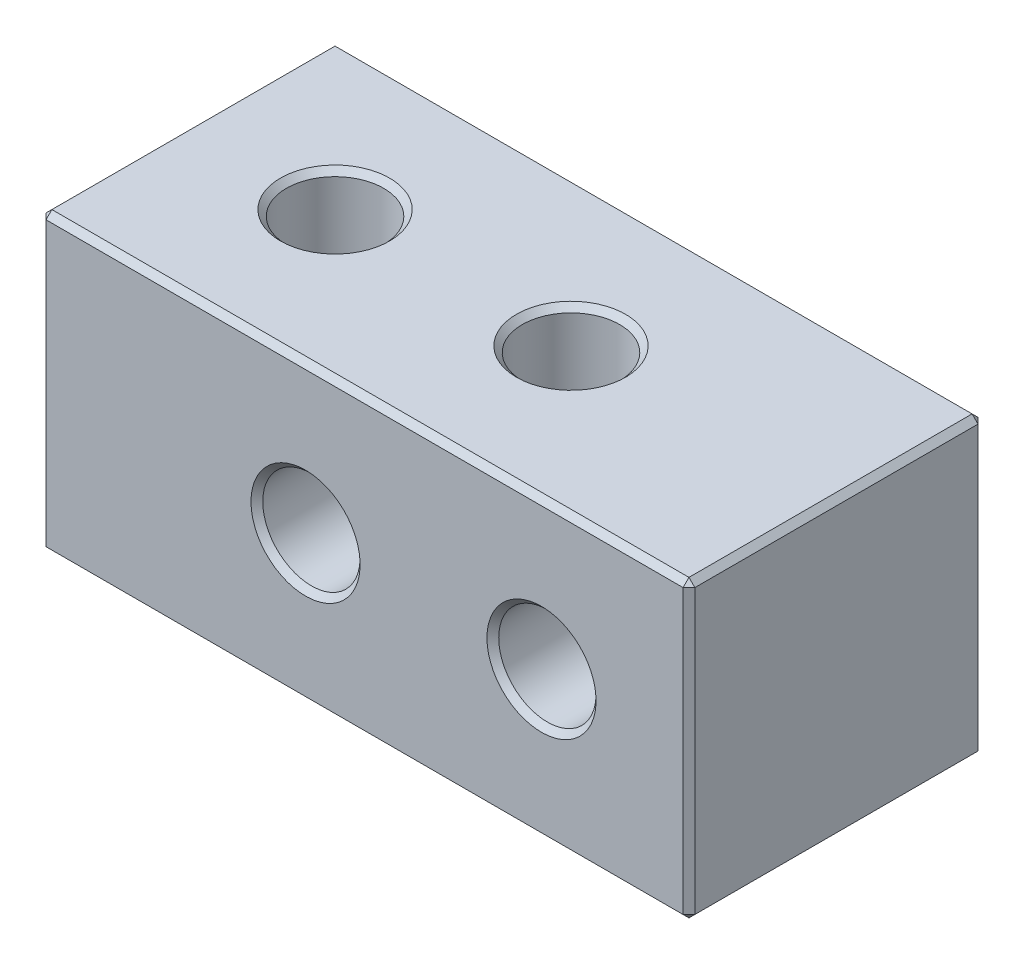
ISO-10303-21;
HEADER;
FILE_DESCRIPTION(('STEP AP214'),'2;1');
FILE_NAME('part.step','',(''),(''),'','','');
FILE_SCHEMA(('AUTOMOTIVE_DESIGN { 1 0 10303 214 1 1 1 1 }'));
ENDSEC;
DATA;
#1=APPLICATION_CONTEXT('core data for automotive mechanical design processes');
#2=APPLICATION_PROTOCOL_DEFINITION('international standard','automotive_design',2000,#1);
#3=PRODUCT_CONTEXT('',#1,'mechanical');
#4=PRODUCT('Part','Part','',(#3));
#5=PRODUCT_RELATED_PRODUCT_CATEGORY('part','',(#4));
#6=PRODUCT_DEFINITION_FORMATION('','',#4);
#7=PRODUCT_DEFINITION_CONTEXT('part definition',#1,'design');
#8=PRODUCT_DEFINITION('design','',#6,#7);
#9=PRODUCT_DEFINITION_SHAPE('','',#8);
#10=(LENGTH_UNIT() NAMED_UNIT(*) SI_UNIT(.MILLI.,.METRE.));
#11=(NAMED_UNIT(*) PLANE_ANGLE_UNIT() SI_UNIT($,.RADIAN.));
#12=(NAMED_UNIT(*) SI_UNIT($,.STERADIAN.) SOLID_ANGLE_UNIT());
#13=UNCERTAINTY_MEASURE_WITH_UNIT(LENGTH_MEASURE(1.E-05),#10,'distance_accuracy_value','');
#14=(GEOMETRIC_REPRESENTATION_CONTEXT(3) GLOBAL_UNCERTAINTY_ASSIGNED_CONTEXT((#13)) GLOBAL_UNIT_ASSIGNED_CONTEXT((#10,
#11,#12)) REPRESENTATION_CONTEXT('',''));
#15=CARTESIAN_POINT('',(0.,0.,0.));
#16=DIRECTION('',(0.,0.,1.));
#17=DIRECTION('',(1.,0.,0.));
#18=AXIS2_PLACEMENT_3D('',#15,#16,#17);
#19=CARTESIAN_POINT('',(11.,5.,-5.));
#20=DIRECTION('',(-1.,0.,0.));
#21=DIRECTION('',(0.,0.,1.));
#22=AXIS2_PLACEMENT_3D('',#19,#20,#21);
#23=PLANE('',#22);
#24=DIRECTION('',(0.,-1.,0.));
#25=VECTOR('',#24,1.);
#26=CARTESIAN_POINT('',(11.,5.,4.8));
#27=LINE('',#26,#25);
#28=CARTESIAN_POINT('',(11.,4.8,4.8));
#29=VERTEX_POINT('',#28);
#30=CARTESIAN_POINT('',(11.,-4.8,4.8));
#31=VERTEX_POINT('',#30);
#32=EDGE_CURVE('E241',#29,#31,#27,.T.);
#33=ORIENTED_EDGE('',*,*,#32,.T.);
#34=DIRECTION('',(0.,0.,-1.));
#35=VECTOR('',#34,1.);
#36=CARTESIAN_POINT('',(11.,-4.8,-5.));
#37=LINE('',#36,#35);
#38=CARTESIAN_POINT('',(11.,-4.8,-4.8));
#39=VERTEX_POINT('',#38);
#40=EDGE_CURVE('E243',#31,#39,#37,.T.);
#41=ORIENTED_EDGE('',*,*,#40,.T.);
#42=DIRECTION('',(0.,1.,0.));
#43=VECTOR('',#42,1.);
#44=CARTESIAN_POINT('',(11.,5.,-4.8));
#45=LINE('',#44,#43);
#46=CARTESIAN_POINT('',(11.,4.8,-4.8));
#47=VERTEX_POINT('',#46);
#48=EDGE_CURVE('E237',#39,#47,#45,.T.);
#49=ORIENTED_EDGE('',*,*,#48,.T.);
#50=DIRECTION('',(0.,0.,1.));
#51=VECTOR('',#50,1.);
#52=CARTESIAN_POINT('',(11.,4.8,5.));
#53=LINE('',#52,#51);
#54=EDGE_CURVE('E239',#47,#29,#53,.T.);
#55=ORIENTED_EDGE('',*,*,#54,.T.);
#56=EDGE_LOOP('',(#33,#41,#49,#55));
#57=FACE_BOUND('',#56,.T.);
#58=ADVANCED_FACE('F41',(#57),#23,.F.);
#59=CARTESIAN_POINT('',(-11.,5.,-5.));
#60=DIRECTION('',(0.,0.,1.));
#61=DIRECTION('',(1.,0.,0.));
#62=AXIS2_PLACEMENT_3D('',#59,#60,#61);
#63=PLANE('',#62);
#64=DIRECTION('',(1.,0.,0.));
#65=VECTOR('',#64,1.);
#66=CARTESIAN_POINT('',(11.,4.8,-5.));
#67=LINE('',#66,#65);
#68=CARTESIAN_POINT('',(-10.8,4.8,-5.));
#69=VERTEX_POINT('',#68);
#70=CARTESIAN_POINT('',(10.8,4.8,-5.));
#71=VERTEX_POINT('',#70);
#72=EDGE_CURVE('E51',#69,#71,#67,.T.);
#73=ORIENTED_EDGE('',*,*,#72,.T.);
#74=DIRECTION('',(0.,-1.,0.));
#75=VECTOR('',#74,1.);
#76=CARTESIAN_POINT('',(10.8,5.,-5.));
#77=LINE('',#76,#75);
#78=CARTESIAN_POINT('',(10.8,-4.8,-5.));
#79=VERTEX_POINT('',#78);
#80=EDGE_CURVE('E11',#71,#79,#77,.T.);
#81=ORIENTED_EDGE('',*,*,#80,.T.);
#82=DIRECTION('',(-1.,0.,0.));
#83=VECTOR('',#82,1.);
#84=CARTESIAN_POINT('',(-11.,-4.8,-5.));
#85=LINE('',#84,#83);
#86=CARTESIAN_POINT('',(-10.8,-4.8,-5.));
#87=VERTEX_POINT('',#86);
#88=EDGE_CURVE('E252',#79,#87,#85,.T.);
#89=ORIENTED_EDGE('',*,*,#88,.T.);
#90=DIRECTION('',(0.,1.,0.));
#91=VECTOR('',#90,1.);
#92=CARTESIAN_POINT('',(-10.8,5.,-5.));
#93=LINE('',#92,#91);
#94=EDGE_CURVE('E62',#87,#69,#93,.T.);
#95=ORIENTED_EDGE('',*,*,#94,.T.);
#96=EDGE_LOOP('',(#73,#81,#89,#95));
#97=FACE_BOUND('',#96,.T.);
#98=CARTESIAN_POINT('',(-2.,0.,-5.));
#99=DIRECTION('',(0.,0.,1.));
#100=DIRECTION('',(1.,0.,0.));
#101=AXIS2_PLACEMENT_3D('',#98,#99,#100);
#102=CIRCLE('',#101,1.85);
#103=CARTESIAN_POINT('',(-0.150000000000001,0.,-5.));
#104=VERTEX_POINT('',#103);
#105=EDGE_CURVE('E249',#104,#104,#102,.T.);
#106=ORIENTED_EDGE('',*,*,#105,.T.);
#107=EDGE_LOOP('',(#106));
#108=FACE_BOUND('',#107,.T.);
#109=CARTESIAN_POINT('',(6.,0.,-5.));
#110=DIRECTION('',(0.,0.,1.));
#111=DIRECTION('',(1.,0.,0.));
#112=AXIS2_PLACEMENT_3D('',#109,#110,#111);
#113=CIRCLE('',#112,1.84999999999999);
#114=CARTESIAN_POINT('',(4.15,0.,-5.));
#115=VERTEX_POINT('',#114);
#116=EDGE_CURVE('E246',#115,#115,#113,.T.);
#117=ORIENTED_EDGE('',*,*,#116,.T.);
#118=EDGE_LOOP('',(#117));
#119=FACE_BOUND('',#118,.T.);
#120=ADVANCED_FACE('F324',(#97,#108,#119),#63,.F.);
#121=CARTESIAN_POINT('',(-11.,5.,-5.));
#122=DIRECTION('',(1.,0.,0.));
#123=DIRECTION('',(0.,0.,-1.));
#124=AXIS2_PLACEMENT_3D('',#121,#122,#123);
#125=PLANE('',#124);
#126=DIRECTION('',(0.,-1.,0.));
#127=VECTOR('',#126,1.);
#128=CARTESIAN_POINT('',(-11.,5.,-4.8));
#129=LINE('',#128,#127);
#130=CARTESIAN_POINT('',(-11.,4.8,-4.8));
#131=VERTEX_POINT('',#130);
#132=CARTESIAN_POINT('',(-11.,-4.8,-4.8));
#133=VERTEX_POINT('',#132);
#134=EDGE_CURVE('E230',#131,#133,#129,.T.);
#135=ORIENTED_EDGE('',*,*,#134,.T.);
#136=DIRECTION('',(0.,0.,1.));
#137=VECTOR('',#136,1.);
#138=CARTESIAN_POINT('',(-11.,-4.8,-5.));
#139=LINE('',#138,#137);
#140=CARTESIAN_POINT('',(-11.,-4.8,4.8));
#141=VERTEX_POINT('',#140);
#142=EDGE_CURVE('E138',#133,#141,#139,.T.);
#143=ORIENTED_EDGE('',*,*,#142,.T.);
#144=DIRECTION('',(0.,1.,0.));
#145=VECTOR('',#144,1.);
#146=CARTESIAN_POINT('',(-11.,5.,4.8));
#147=LINE('',#146,#145);
#148=CARTESIAN_POINT('',(-11.,4.8,4.8));
#149=VERTEX_POINT('',#148);
#150=EDGE_CURVE('E234',#141,#149,#147,.T.);
#151=ORIENTED_EDGE('',*,*,#150,.T.);
#152=DIRECTION('',(0.,0.,-1.));
#153=VECTOR('',#152,1.);
#154=CARTESIAN_POINT('',(-11.,4.8,-5.));
#155=LINE('',#154,#153);
#156=EDGE_CURVE('E232',#149,#131,#155,.T.);
#157=ORIENTED_EDGE('',*,*,#156,.T.);
#158=EDGE_LOOP('',(#135,#143,#151,#157));
#159=FACE_BOUND('',#158,.T.);
#160=ADVANCED_FACE('F381',(#159),#125,.F.);
#161=CARTESIAN_POINT('',(-11.,5.,5.));
#162=DIRECTION('',(0.,0.,-1.));
#163=DIRECTION('',(-1.,0.,0.));
#164=AXIS2_PLACEMENT_3D('',#161,#162,#163);
#165=PLANE('',#164);
#166=CARTESIAN_POINT('',(-2.,0.,5.));
#167=DIRECTION('',(0.,0.,-1.));
#168=DIRECTION('',(-1.,0.,0.));
#169=AXIS2_PLACEMENT_3D('',#166,#167,#168);
#170=CIRCLE('',#169,1.85);
#171=CARTESIAN_POINT('',(-3.85,0.,5.));
#172=VERTEX_POINT('',#171);
#173=EDGE_CURVE('E200',#172,#172,#170,.T.);
#174=ORIENTED_EDGE('',*,*,#173,.T.);
#175=EDGE_LOOP('',(#174));
#176=FACE_BOUND('',#175,.T.);
#177=CARTESIAN_POINT('',(6.,0.,5.));
#178=DIRECTION('',(0.,0.,-1.));
#179=DIRECTION('',(-1.,0.,0.));
#180=AXIS2_PLACEMENT_3D('',#177,#178,#179);
#181=CIRCLE('',#180,1.85);
#182=CARTESIAN_POINT('',(4.15,0.,5.));
#183=VERTEX_POINT('',#182);
#184=EDGE_CURVE('E197',#183,#183,#181,.T.);
#185=ORIENTED_EDGE('',*,*,#184,.T.);
#186=EDGE_LOOP('',(#185));
#187=FACE_BOUND('',#186,.T.);
#188=DIRECTION('',(-1.,0.,0.));
#189=VECTOR('',#188,1.);
#190=CARTESIAN_POINT('',(-11.,4.8,5.));
#191=LINE('',#190,#189);
#192=CARTESIAN_POINT('',(10.8,4.8,5.));
#193=VERTEX_POINT('',#192);
#194=CARTESIAN_POINT('',(-10.8,4.8,5.));
#195=VERTEX_POINT('',#194);
#196=EDGE_CURVE('E188',#193,#195,#191,.T.);
#197=ORIENTED_EDGE('',*,*,#196,.T.);
#198=DIRECTION('',(0.,-1.,0.));
#199=VECTOR('',#198,1.);
#200=CARTESIAN_POINT('',(-10.8,5.,5.));
#201=LINE('',#200,#199);
#202=CARTESIAN_POINT('',(-10.8,-4.8,5.));
#203=VERTEX_POINT('',#202);
#204=EDGE_CURVE('E194',#195,#203,#201,.T.);
#205=ORIENTED_EDGE('',*,*,#204,.T.);
#206=DIRECTION('',(1.,0.,0.));
#207=VECTOR('',#206,1.);
#208=CARTESIAN_POINT('',(-11.,-4.8,5.));
#209=LINE('',#208,#207);
#210=CARTESIAN_POINT('',(10.8,-4.8,5.));
#211=VERTEX_POINT('',#210);
#212=EDGE_CURVE('E192',#203,#211,#209,.T.);
#213=ORIENTED_EDGE('',*,*,#212,.T.);
#214=DIRECTION('',(0.,1.,0.));
#215=VECTOR('',#214,1.);
#216=CARTESIAN_POINT('',(10.8,5.,5.));
#217=LINE('',#216,#215);
#218=EDGE_CURVE('E190',#211,#193,#217,.T.);
#219=ORIENTED_EDGE('',*,*,#218,.T.);
#220=EDGE_LOOP('',(#197,#205,#213,#219));
#221=FACE_BOUND('',#220,.T.);
#222=ADVANCED_FACE('F556',(#176,#187,#221),#165,.F.);
#223=CARTESIAN_POINT('',(0.,5.,0.));
#224=DIRECTION('',(0.,1.,0.));
#225=DIRECTION('',(0.,0.,1.));
#226=AXIS2_PLACEMENT_3D('',#223,#224,#225);
#227=PLANE('',#226);
#228=CARTESIAN_POINT('',(2.,5.,0.));
#229=DIRECTION('',(0.,1.,0.));
#230=DIRECTION('',(0.,0.,1.));
#231=AXIS2_PLACEMENT_3D('',#228,#229,#230);
#232=CIRCLE('',#231,1.84999999999999);
#233=CARTESIAN_POINT('',(2.,5.,1.84999999999999));
#234=VERTEX_POINT('',#233);
#235=EDGE_CURVE('E227',#234,#234,#232,.F.);
#236=ORIENTED_EDGE('',*,*,#235,.T.);
#237=EDGE_LOOP('',(#236));
#238=FACE_BOUND('',#237,.T.);
#239=CARTESIAN_POINT('',(-6.,5.,0.));
#240=DIRECTION('',(0.,1.,0.));
#241=DIRECTION('',(0.,0.,1.));
#242=AXIS2_PLACEMENT_3D('',#239,#240,#241);
#243=CIRCLE('',#242,1.84999999999999);
#244=CARTESIAN_POINT('',(-6.,5.,1.84999999999999));
#245=VERTEX_POINT('',#244);
#246=EDGE_CURVE('E224',#245,#245,#243,.F.);
#247=ORIENTED_EDGE('',*,*,#246,.T.);
#248=EDGE_LOOP('',(#247));
#249=FACE_BOUND('',#248,.T.);
#250=DIRECTION('',(0.,0.,1.));
#251=VECTOR('',#250,1.);
#252=CARTESIAN_POINT('',(-10.8,5.,5.));
#253=LINE('',#252,#251);
#254=CARTESIAN_POINT('',(-10.8,5.,-4.8));
#255=VERTEX_POINT('',#254);
#256=CARTESIAN_POINT('',(-10.8,5.,4.8));
#257=VERTEX_POINT('',#256);
#258=EDGE_CURVE('E219',#255,#257,#253,.T.);
#259=ORIENTED_EDGE('',*,*,#258,.T.);
#260=DIRECTION('',(1.,0.,0.));
#261=VECTOR('',#260,1.);
#262=CARTESIAN_POINT('',(11.,5.,4.8));
#263=LINE('',#262,#261);
#264=CARTESIAN_POINT('',(10.8,5.,4.8));
#265=VERTEX_POINT('',#264);
#266=EDGE_CURVE('E221',#257,#265,#263,.T.);
#267=ORIENTED_EDGE('',*,*,#266,.T.);
#268=DIRECTION('',(0.,0.,-1.));
#269=VECTOR('',#268,1.);
#270=CARTESIAN_POINT('',(10.8,5.,-5.));
#271=LINE('',#270,#269);
#272=CARTESIAN_POINT('',(10.8,5.,-4.8));
#273=VERTEX_POINT('',#272);
#274=EDGE_CURVE('E217',#265,#273,#271,.T.);
#275=ORIENTED_EDGE('',*,*,#274,.T.);
#276=DIRECTION('',(-1.,0.,0.));
#277=VECTOR('',#276,1.);
#278=CARTESIAN_POINT('',(-11.,5.,-4.8));
#279=LINE('',#278,#277);
#280=EDGE_CURVE('E215',#273,#255,#279,.T.);
#281=ORIENTED_EDGE('',*,*,#280,.T.);
#282=EDGE_LOOP('',(#259,#267,#275,#281));
#283=FACE_BOUND('',#282,.T.);
#284=ADVANCED_FACE('F338',(#238,#249,#283),#227,.T.);
#285=CARTESIAN_POINT('',(0.,-5.,0.));
#286=DIRECTION('',(0.,1.,0.));
#287=DIRECTION('',(0.,0.,1.));
#288=AXIS2_PLACEMENT_3D('',#285,#286,#287);
#289=PLANE('',#288);
#290=CARTESIAN_POINT('',(2.,-5.,0.));
#291=DIRECTION('',(0.,1.,0.));
#292=DIRECTION('',(0.,0.,1.));
#293=AXIS2_PLACEMENT_3D('',#290,#291,#292);
#294=CIRCLE('',#293,1.84999999999999);
#295=CARTESIAN_POINT('',(2.,-5.,1.84999999999999));
#296=VERTEX_POINT('',#295);
#297=EDGE_CURVE('E173',#296,#296,#294,.T.);
#298=ORIENTED_EDGE('',*,*,#297,.T.);
#299=EDGE_LOOP('',(#298));
#300=FACE_BOUND('',#299,.T.);
#301=CARTESIAN_POINT('',(-6.,-5.,0.));
#302=DIRECTION('',(0.,1.,0.));
#303=DIRECTION('',(0.,0.,1.));
#304=AXIS2_PLACEMENT_3D('',#301,#302,#303);
#305=CIRCLE('',#304,1.84999999999999);
#306=CARTESIAN_POINT('',(-6.,-5.,1.84999999999999));
#307=VERTEX_POINT('',#306);
#308=EDGE_CURVE('E167',#307,#307,#305,.T.);
#309=ORIENTED_EDGE('',*,*,#308,.T.);
#310=EDGE_LOOP('',(#309));
#311=FACE_BOUND('',#310,.T.);
#312=DIRECTION('',(0.,0.,1.));
#313=VECTOR('',#312,1.);
#314=CARTESIAN_POINT('',(10.8,-5.,0.));
#315=LINE('',#314,#313);
#316=CARTESIAN_POINT('',(10.8,-5.,-4.8));
#317=VERTEX_POINT('',#316);
#318=CARTESIAN_POINT('',(10.8,-5.,4.8));
#319=VERTEX_POINT('',#318);
#320=EDGE_CURVE('E160',#317,#319,#315,.T.);
#321=ORIENTED_EDGE('',*,*,#320,.T.);
#322=DIRECTION('',(-1.,0.,0.));
#323=VECTOR('',#322,1.);
#324=CARTESIAN_POINT('',(0.,-5.,4.8));
#325=LINE('',#324,#323);
#326=CARTESIAN_POINT('',(-10.8,-5.,4.8));
#327=VERTEX_POINT('',#326);
#328=EDGE_CURVE('E164',#319,#327,#325,.T.);
#329=ORIENTED_EDGE('',*,*,#328,.T.);
#330=DIRECTION('',(0.,0.,-1.));
#331=VECTOR('',#330,1.);
#332=CARTESIAN_POINT('',(-10.8,-5.,0.));
#333=LINE('',#332,#331);
#334=CARTESIAN_POINT('',(-10.8,-5.,-4.8));
#335=VERTEX_POINT('',#334);
#336=EDGE_CURVE('E135',#327,#335,#333,.T.);
#337=ORIENTED_EDGE('',*,*,#336,.T.);
#338=DIRECTION('',(1.,0.,0.));
#339=VECTOR('',#338,1.);
#340=CARTESIAN_POINT('',(0.,-5.,-4.8));
#341=LINE('',#340,#339);
#342=EDGE_CURVE('E154',#335,#317,#341,.T.);
#343=ORIENTED_EDGE('',*,*,#342,.T.);
#344=EDGE_LOOP('',(#321,#329,#337,#343));
#345=FACE_BOUND('',#344,.T.);
#346=ADVANCED_FACE('F162',(#300,#311,#345),#289,.F.);
#347=CARTESIAN_POINT('',(2.,5.,0.));
#348=DIRECTION('',(0.,1.,0.));
#349=DIRECTION('',(0.,0.,1.));
#350=AXIS2_PLACEMENT_3D('',#347,#348,#349);
#351=CYLINDRICAL_SURFACE('',#350,1.65);
#352=CARTESIAN_POINT('',(2.,-4.8,0.));
#353=DIRECTION('',(0.,1.,0.));
#354=DIRECTION('',(0.,0.,1.));
#355=AXIS2_PLACEMENT_3D('',#352,#353,#354);
#356=CIRCLE('',#355,1.65);
#357=CARTESIAN_POINT('',(2.,-4.8,1.65));
#358=VERTEX_POINT('',#357);
#359=EDGE_CURVE('E179',#358,#358,#356,.F.);
#360=ORIENTED_EDGE('',*,*,#359,.T.);
#361=EDGE_LOOP('',(#360));
#362=FACE_BOUND('',#361,.T.);
#363=CARTESIAN_POINT('',(2.,4.8,0.));
#364=DIRECTION('',(0.,1.,0.));
#365=DIRECTION('',(0.,0.,1.));
#366=AXIS2_PLACEMENT_3D('',#363,#364,#365);
#367=CIRCLE('',#366,1.65);
#368=CARTESIAN_POINT('',(2.,4.8,1.65));
#369=VERTEX_POINT('',#368);
#370=EDGE_CURVE('E176',#369,#369,#367,.T.);
#371=ORIENTED_EDGE('',*,*,#370,.T.);
#372=EDGE_LOOP('',(#371));
#373=FACE_BOUND('',#372,.T.);
#374=ADVANCED_FACE('F547',(#362,#373),#351,.F.);
#375=CARTESIAN_POINT('',(-6.,5.,0.));
#376=DIRECTION('',(0.,1.,0.));
#377=DIRECTION('',(0.,0.,1.));
#378=AXIS2_PLACEMENT_3D('',#375,#376,#377);
#379=CYLINDRICAL_SURFACE('',#378,1.65);
#380=CARTESIAN_POINT('',(-6.,-4.8,0.));
#381=DIRECTION('',(0.,1.,0.));
#382=DIRECTION('',(0.,0.,1.));
#383=AXIS2_PLACEMENT_3D('',#380,#381,#382);
#384=CIRCLE('',#383,1.65);
#385=CARTESIAN_POINT('',(-6.,-4.8,1.65));
#386=VERTEX_POINT('',#385);
#387=EDGE_CURVE('E185',#386,#386,#384,.F.);
#388=ORIENTED_EDGE('',*,*,#387,.T.);
#389=EDGE_LOOP('',(#388));
#390=FACE_BOUND('',#389,.T.);
#391=CARTESIAN_POINT('',(-6.,4.8,0.));
#392=DIRECTION('',(0.,1.,0.));
#393=DIRECTION('',(0.,0.,1.));
#394=AXIS2_PLACEMENT_3D('',#391,#392,#393);
#395=CIRCLE('',#394,1.65);
#396=CARTESIAN_POINT('',(-6.,4.8,1.65));
#397=VERTEX_POINT('',#396);
#398=EDGE_CURVE('E182',#397,#397,#395,.T.);
#399=ORIENTED_EDGE('',*,*,#398,.T.);
#400=EDGE_LOOP('',(#399));
#401=FACE_BOUND('',#400,.T.);
#402=ADVANCED_FACE('F538',(#390,#401),#379,.F.);
#403=CARTESIAN_POINT('',(-2.,0.,-5.));
#404=DIRECTION('',(0.,0.,-1.));
#405=DIRECTION('',(-1.,0.,0.));
#406=AXIS2_PLACEMENT_3D('',#403,#404,#405);
#407=CYLINDRICAL_SURFACE('',#406,1.65);
#408=CARTESIAN_POINT('',(-2.,0.,4.8));
#409=DIRECTION('',(0.,0.,-1.));
#410=DIRECTION('',(-1.,0.,0.));
#411=AXIS2_PLACEMENT_3D('',#408,#409,#410);
#412=CIRCLE('',#411,1.65);
#413=CARTESIAN_POINT('',(-3.65,0.,4.8));
#414=VERTEX_POINT('',#413);
#415=EDGE_CURVE('E206',#414,#414,#412,.F.);
#416=ORIENTED_EDGE('',*,*,#415,.T.);
#417=EDGE_LOOP('',(#416));
#418=FACE_BOUND('',#417,.T.);
#419=CARTESIAN_POINT('',(-2.,0.,-4.8));
#420=DIRECTION('',(0.,0.,1.));
#421=DIRECTION('',(1.,0.,0.));
#422=AXIS2_PLACEMENT_3D('',#419,#420,#421);
#423=CIRCLE('',#422,1.65);
#424=CARTESIAN_POINT('',(-0.350000000000003,0.,-4.8));
#425=VERTEX_POINT('',#424);
#426=EDGE_CURVE('E203',#425,#425,#423,.F.);
#427=ORIENTED_EDGE('',*,*,#426,.T.);
#428=EDGE_LOOP('',(#427));
#429=FACE_BOUND('',#428,.T.);
#430=ADVANCED_FACE('F536',(#418,#429),#407,.F.);
#431=CARTESIAN_POINT('',(6.,0.,-5.));
#432=DIRECTION('',(0.,0.,-1.));
#433=DIRECTION('',(-1.,0.,0.));
#434=AXIS2_PLACEMENT_3D('',#431,#432,#433);
#435=CYLINDRICAL_SURFACE('',#434,1.65);
#436=CARTESIAN_POINT('',(6.,0.,4.8));
#437=DIRECTION('',(0.,0.,-1.));
#438=DIRECTION('',(-1.,0.,0.));
#439=AXIS2_PLACEMENT_3D('',#436,#437,#438);
#440=CIRCLE('',#439,1.65);
#441=CARTESIAN_POINT('',(4.35,0.,4.8));
#442=VERTEX_POINT('',#441);
#443=EDGE_CURVE('E212',#442,#442,#440,.F.);
#444=ORIENTED_EDGE('',*,*,#443,.T.);
#445=EDGE_LOOP('',(#444));
#446=FACE_BOUND('',#445,.T.);
#447=CARTESIAN_POINT('',(6.,0.,-4.80000000000001));
#448=DIRECTION('',(0.,0.,1.));
#449=DIRECTION('',(1.,0.,0.));
#450=AXIS2_PLACEMENT_3D('',#447,#448,#449);
#451=CIRCLE('',#450,1.65);
#452=CARTESIAN_POINT('',(4.35,0.,-4.80000000000001));
#453=VERTEX_POINT('',#452);
#454=EDGE_CURVE('E209',#453,#453,#451,.F.);
#455=ORIENTED_EDGE('',*,*,#454,.T.);
#456=EDGE_LOOP('',(#455));
#457=FACE_BOUND('',#456,.T.);
#458=ADVANCED_FACE('F393',(#446,#457),#435,.F.);
#459=CARTESIAN_POINT('',(2.,-5.,0.));
#460=DIRECTION('',(0.,-1.,0.));
#461=DIRECTION('',(0.,0.,-1.));
#462=AXIS2_PLACEMENT_3D('',#459,#460,#461);
#463=CONICAL_SURFACE('',#462,1.84999999999999,0.785398163397445);
#464=ORIENTED_EDGE('',*,*,#359,.F.);
#465=EDGE_LOOP('',(#464));
#466=FACE_BOUND('',#465,.T.);
#467=ORIENTED_EDGE('',*,*,#297,.F.);
#468=EDGE_LOOP('',(#467));
#469=FACE_BOUND('',#468,.T.);
#470=ADVANCED_FACE('F386',(#466,#469),#463,.F.);
#471=CARTESIAN_POINT('',(-6.,-5.,0.));
#472=DIRECTION('',(0.,-1.,0.));
#473=DIRECTION('',(0.,0.,-1.));
#474=AXIS2_PLACEMENT_3D('',#471,#472,#473);
#475=CONICAL_SURFACE('',#474,1.84999999999999,0.785398163397445);
#476=ORIENTED_EDGE('',*,*,#387,.F.);
#477=EDGE_LOOP('',(#476));
#478=FACE_BOUND('',#477,.T.);
#479=ORIENTED_EDGE('',*,*,#308,.F.);
#480=EDGE_LOOP('',(#479));
#481=FACE_BOUND('',#480,.T.);
#482=ADVANCED_FACE('F392',(#478,#481),#475,.F.);
#483=CARTESIAN_POINT('',(-2.,0.,5.));
#484=DIRECTION('',(0.,0.,1.));
#485=DIRECTION('',(1.,0.,0.));
#486=AXIS2_PLACEMENT_3D('',#483,#484,#485);
#487=CONICAL_SURFACE('',#486,1.85,0.785398163397453);
#488=ORIENTED_EDGE('',*,*,#415,.F.);
#489=EDGE_LOOP('',(#488));
#490=FACE_BOUND('',#489,.T.);
#491=ORIENTED_EDGE('',*,*,#173,.F.);
#492=EDGE_LOOP('',(#491));
#493=FACE_BOUND('',#492,.T.);
#494=ADVANCED_FACE('F400',(#490,#493),#487,.F.);
#495=CARTESIAN_POINT('',(6.,0.,5.));
#496=DIRECTION('',(0.,0.,1.));
#497=DIRECTION('',(1.,0.,0.));
#498=AXIS2_PLACEMENT_3D('',#495,#496,#497);
#499=CONICAL_SURFACE('',#498,1.85,0.785398163397453);
#500=ORIENTED_EDGE('',*,*,#443,.F.);
#501=EDGE_LOOP('',(#500));
#502=FACE_BOUND('',#501,.T.);
#503=ORIENTED_EDGE('',*,*,#184,.F.);
#504=EDGE_LOOP('',(#503));
#505=FACE_BOUND('',#504,.T.);
#506=ADVANCED_FACE('F407',(#502,#505),#499,.F.);
#507=CARTESIAN_POINT('',(2.,4.8,0.));
#508=DIRECTION('',(0.,1.,0.));
#509=DIRECTION('',(0.,0.,1.));
#510=AXIS2_PLACEMENT_3D('',#507,#508,#509);
#511=CONICAL_SURFACE('',#510,1.65,0.785398163397443);
#512=ORIENTED_EDGE('',*,*,#235,.F.);
#513=EDGE_LOOP('',(#512));
#514=FACE_BOUND('',#513,.T.);
#515=ORIENTED_EDGE('',*,*,#370,.F.);
#516=EDGE_LOOP('',(#515));
#517=FACE_BOUND('',#516,.T.);
#518=ADVANCED_FACE('F414',(#514,#517),#511,.F.);
#519=CARTESIAN_POINT('',(-6.,4.8,0.));
#520=DIRECTION('',(0.,1.,0.));
#521=DIRECTION('',(0.,0.,1.));
#522=AXIS2_PLACEMENT_3D('',#519,#520,#521);
#523=CONICAL_SURFACE('',#522,1.65,0.785398163397443);
#524=ORIENTED_EDGE('',*,*,#246,.F.);
#525=EDGE_LOOP('',(#524));
#526=FACE_BOUND('',#525,.T.);
#527=ORIENTED_EDGE('',*,*,#398,.F.);
#528=EDGE_LOOP('',(#527));
#529=FACE_BOUND('',#528,.T.);
#530=ADVANCED_FACE('F421',(#526,#529),#523,.F.);
#531=CARTESIAN_POINT('',(10.8,5.,0.));
#532=DIRECTION('',(0.707106781186541,0.707106781186554,0.));
#533=DIRECTION('',(0.,0.,1.));
#534=AXIS2_PLACEMENT_3D('',#531,#532,#533);
#535=PLANE('',#534);
#536=DIRECTION('',(0.707106781186554,-0.707106781186541,0.));
#537=VECTOR('',#536,1.);
#538=CARTESIAN_POINT('',(10.8,5.,-4.8));
#539=LINE('',#538,#537);
#540=EDGE_CURVE('E46',#273,#47,#539,.T.);
#541=ORIENTED_EDGE('',*,*,#540,.F.);
#542=ORIENTED_EDGE('',*,*,#274,.F.);
#543=DIRECTION('',(-0.707106781186554,0.707106781186541,0.));
#544=VECTOR('',#543,1.);
#545=CARTESIAN_POINT('',(10.9,4.9,4.8));
#546=LINE('',#545,#544);
#547=EDGE_CURVE('E303',#29,#265,#546,.T.);
#548=ORIENTED_EDGE('',*,*,#547,.F.);
#549=ORIENTED_EDGE('',*,*,#54,.F.);
#550=EDGE_LOOP('',(#541,#542,#548,#549));
#551=FACE_BOUND('',#550,.T.);
#552=ADVANCED_FACE('F428',(#551),#535,.T.);
#553=CARTESIAN_POINT('',(10.8,5.,-4.8));
#554=DIRECTION('',(0.577350269189616,0.577350269189626,-0.577350269189636));
#555=DIRECTION('',(0.,0.707106781186554,0.707106781186541));
#556=AXIS2_PLACEMENT_3D('',#553,#554,#555);
#557=PLANE('',#556);
#558=DIRECTION('',(0.,0.707106781186554,0.707106781186541));
#559=VECTOR('',#558,1.);
#560=CARTESIAN_POINT('',(10.8,5.,-4.8));
#561=LINE('',#560,#559);
#562=EDGE_CURVE('E299',#273,#71,#561,.F.);
#563=ORIENTED_EDGE('',*,*,#562,.F.);
#564=ORIENTED_EDGE('',*,*,#540,.T.);
#565=DIRECTION('',(0.707106781186554,0.,0.707106781186541));
#566=VECTOR('',#565,1.);
#567=CARTESIAN_POINT('',(10.9,4.8,-4.9));
#568=LINE('',#567,#566);
#569=EDGE_CURVE('E301',#71,#47,#568,.T.);
#570=ORIENTED_EDGE('',*,*,#569,.F.);
#571=EDGE_LOOP('',(#563,#564,#570));
#572=FACE_BOUND('',#571,.T.);
#573=ADVANCED_FACE('F315',(#572),#557,.T.);
#574=CARTESIAN_POINT('',(10.8,4.8,5.));
#575=DIRECTION('',(0.577350269189626,0.577350269189636,0.577350269189616));
#576=DIRECTION('',(-0.707106781186554,0.707106781186541,0.));
#577=AXIS2_PLACEMENT_3D('',#574,#575,#576);
#578=PLANE('',#577);
#579=DIRECTION('',(-0.707106781186541,0.,0.707106781186554));
#580=VECTOR('',#579,1.);
#581=CARTESIAN_POINT('',(10.8,4.8,5.));
#582=LINE('',#581,#580);
#583=EDGE_CURVE('E294',#29,#193,#582,.T.);
#584=ORIENTED_EDGE('',*,*,#583,.F.);
#585=ORIENTED_EDGE('',*,*,#547,.T.);
#586=DIRECTION('',(0.,-0.707106781186541,0.707106781186554));
#587=VECTOR('',#586,1.);
#588=CARTESIAN_POINT('',(10.8,4.8,5.));
#589=LINE('',#588,#587);
#590=EDGE_CURVE('E297',#193,#265,#589,.F.);
#591=ORIENTED_EDGE('',*,*,#590,.F.);
#592=EDGE_LOOP('',(#584,#585,#591));
#593=FACE_BOUND('',#592,.T.);
#594=ADVANCED_FACE('F352',(#593),#578,.T.);
#595=CARTESIAN_POINT('',(10.8,5.,-5.));
#596=DIRECTION('',(-0.707106781186541,0.,0.707106781186554));
#597=DIRECTION('',(0.,-1.,0.));
#598=AXIS2_PLACEMENT_3D('',#595,#596,#597);
#599=PLANE('',#598);
#600=ORIENTED_EDGE('',*,*,#569,.T.);
#601=ORIENTED_EDGE('',*,*,#48,.F.);
#602=DIRECTION('',(-0.707106781186554,0.,-0.707106781186541));
#603=VECTOR('',#602,1.);
#604=CARTESIAN_POINT('',(11.,-4.8,-4.8));
#605=LINE('',#604,#603);
#606=EDGE_CURVE('E289',#79,#39,#605,.F.);
#607=ORIENTED_EDGE('',*,*,#606,.F.);
#608=ORIENTED_EDGE('',*,*,#80,.F.);
#609=EDGE_LOOP('',(#600,#601,#607,#608));
#610=FACE_BOUND('',#609,.T.);
#611=ADVANCED_FACE('F322',(#610),#599,.F.);
#612=CARTESIAN_POINT('',(0.,5.,-4.8));
#613=DIRECTION('',(0.,0.707106781186541,-0.707106781186554));
#614=DIRECTION('',(1.,0.,0.));
#615=AXIS2_PLACEMENT_3D('',#612,#613,#614);
#616=PLANE('',#615);
#617=ORIENTED_EDGE('',*,*,#562,.T.);
#618=ORIENTED_EDGE('',*,*,#72,.F.);
#619=DIRECTION('',(0.,-0.707106781186554,-0.707106781186541));
#620=VECTOR('',#619,1.);
#621=CARTESIAN_POINT('',(-10.8,4.9,-4.9));
#622=LINE('',#621,#620);
#623=EDGE_CURVE('E286',#255,#69,#622,.T.);
#624=ORIENTED_EDGE('',*,*,#623,.F.);
#625=ORIENTED_EDGE('',*,*,#280,.F.);
#626=EDGE_LOOP('',(#617,#618,#624,#625));
#627=FACE_BOUND('',#626,.T.);
#628=ADVANCED_FACE('F335',(#627),#616,.T.);
#629=CARTESIAN_POINT('',(-10.8,5.,0.));
#630=DIRECTION('',(-0.707106781186541,0.707106781186554,0.));
#631=DIRECTION('',(0.,0.,-1.));
#632=AXIS2_PLACEMENT_3D('',#629,#630,#631);
#633=PLANE('',#632);
#634=DIRECTION('',(-0.707106781186554,-0.707106781186541,0.));
#635=VECTOR('',#634,1.);
#636=CARTESIAN_POINT('',(-11.,4.8,4.8));
#637=LINE('',#636,#635);
#638=EDGE_CURVE('E280',#257,#149,#637,.T.);
#639=ORIENTED_EDGE('',*,*,#638,.F.);
#640=ORIENTED_EDGE('',*,*,#258,.F.);
#641=DIRECTION('',(0.707106781186554,0.707106781186541,0.));
#642=VECTOR('',#641,1.);
#643=CARTESIAN_POINT('',(-11.,4.8,-4.8));
#644=LINE('',#643,#642);
#645=EDGE_CURVE('E283',#131,#255,#644,.T.);
#646=ORIENTED_EDGE('',*,*,#645,.F.);
#647=ORIENTED_EDGE('',*,*,#156,.F.);
#648=EDGE_LOOP('',(#639,#640,#646,#647));
#649=FACE_BOUND('',#648,.T.);
#650=ADVANCED_FACE('F342',(#649),#633,.T.);
#651=CARTESIAN_POINT('',(0.,5.,4.8));
#652=DIRECTION('',(0.,0.707106781186554,0.707106781186541));
#653=DIRECTION('',(-1.,0.,0.));
#654=AXIS2_PLACEMENT_3D('',#651,#652,#653);
#655=PLANE('',#654);
#656=ORIENTED_EDGE('',*,*,#590,.T.);
#657=ORIENTED_EDGE('',*,*,#266,.F.);
#658=DIRECTION('',(0.,0.707106781186541,-0.707106781186554));
#659=VECTOR('',#658,1.);
#660=CARTESIAN_POINT('',(-10.8,4.9,4.9));
#661=LINE('',#660,#659);
#662=EDGE_CURVE('E277',#195,#257,#661,.T.);
#663=ORIENTED_EDGE('',*,*,#662,.F.);
#664=ORIENTED_EDGE('',*,*,#196,.F.);
#665=EDGE_LOOP('',(#656,#657,#663,#664));
#666=FACE_BOUND('',#665,.T.);
#667=ADVANCED_FACE('F351',(#666),#655,.T.);
#668=CARTESIAN_POINT('',(11.,5.,4.8));
#669=DIRECTION('',(-0.707106781186554,0.,-0.707106781186541));
#670=DIRECTION('',(0.,-1.,0.));
#671=AXIS2_PLACEMENT_3D('',#668,#669,#670);
#672=PLANE('',#671);
#673=ORIENTED_EDGE('',*,*,#583,.T.);
#674=ORIENTED_EDGE('',*,*,#218,.F.);
#675=DIRECTION('',(0.707106781186541,0.,-0.707106781186554));
#676=VECTOR('',#675,1.);
#677=CARTESIAN_POINT('',(10.9,-4.8,4.9));
#678=LINE('',#677,#676);
#679=EDGE_CURVE('E274',#31,#211,#678,.F.);
#680=ORIENTED_EDGE('',*,*,#679,.F.);
#681=ORIENTED_EDGE('',*,*,#32,.F.);
#682=EDGE_LOOP('',(#673,#674,#680,#681));
#683=FACE_BOUND('',#682,.T.);
#684=ADVANCED_FACE('F357',(#683),#672,.F.);
#685=CARTESIAN_POINT('',(11.,-4.8,-5.));
#686=DIRECTION('',(-0.707106781186554,0.707106781186541,0.));
#687=DIRECTION('',(0.,0.,-1.));
#688=AXIS2_PLACEMENT_3D('',#685,#686,#687);
#689=PLANE('',#688);
#690=DIRECTION('',(0.707106781186541,0.707106781186554,0.));
#691=VECTOR('',#690,1.);
#692=CARTESIAN_POINT('',(11.,-4.8,-4.8));
#693=LINE('',#692,#691);
#694=EDGE_CURVE('E291',#39,#317,#693,.F.);
#695=ORIENTED_EDGE('',*,*,#694,.F.);
#696=ORIENTED_EDGE('',*,*,#40,.F.);
#697=DIRECTION('',(-0.707106781186541,-0.707106781186554,0.));
#698=VECTOR('',#697,1.);
#699=CARTESIAN_POINT('',(10.8,-5.,4.8));
#700=LINE('',#699,#698);
#701=EDGE_CURVE('E271',#319,#31,#700,.F.);
#702=ORIENTED_EDGE('',*,*,#701,.F.);
#703=ORIENTED_EDGE('',*,*,#320,.F.);
#704=EDGE_LOOP('',(#695,#696,#702,#703));
#705=FACE_BOUND('',#704,.T.);
#706=ADVANCED_FACE('F363',(#705),#689,.F.);
#707=CARTESIAN_POINT('',(11.,-4.8,-4.8));
#708=DIRECTION('',(0.577350269189626,-0.577350269189616,-0.577350269189636));
#709=DIRECTION('',(-0.707106781186554,0.,-0.707106781186541));
#710=AXIS2_PLACEMENT_3D('',#707,#708,#709);
#711=PLANE('',#710);
#712=ORIENTED_EDGE('',*,*,#606,.T.);
#713=ORIENTED_EDGE('',*,*,#694,.T.);
#714=DIRECTION('',(0.,-0.707106781186554,0.707106781186541));
#715=VECTOR('',#714,1.);
#716=CARTESIAN_POINT('',(10.8,-4.9,-4.9));
#717=LINE('',#716,#715);
#718=EDGE_CURVE('E157',#79,#317,#717,.T.);
#719=ORIENTED_EDGE('',*,*,#718,.F.);
#720=EDGE_LOOP('',(#712,#713,#719));
#721=FACE_BOUND('',#720,.T.);
#722=ADVANCED_FACE('F366',(#721),#711,.T.);
#723=CARTESIAN_POINT('',(-11.,4.8,-4.8));
#724=DIRECTION('',(-0.577350269189616,0.577350269189626,-0.577350269189636));
#725=DIRECTION('',(0.,0.707106781186554,0.707106781186541));
#726=AXIS2_PLACEMENT_3D('',#723,#724,#725);
#727=PLANE('',#726);
#728=ORIENTED_EDGE('',*,*,#645,.T.);
#729=ORIENTED_EDGE('',*,*,#623,.T.);
#730=DIRECTION('',(0.707106781186554,0.,-0.707106781186541));
#731=VECTOR('',#730,1.);
#732=CARTESIAN_POINT('',(-11.,4.8,-4.8));
#733=LINE('',#732,#731);
#734=EDGE_CURVE('E267',#131,#69,#733,.T.);
#735=ORIENTED_EDGE('',*,*,#734,.F.);
#736=EDGE_LOOP('',(#728,#729,#735));
#737=FACE_BOUND('',#736,.T.);
#738=ADVANCED_FACE('F331',(#737),#727,.T.);
#739=CARTESIAN_POINT('',(-11.,4.8,4.8));
#740=DIRECTION('',(-0.577350269189616,0.577350269189636,0.577350269189626));
#741=DIRECTION('',(0.,-0.707106781186541,0.707106781186554));
#742=AXIS2_PLACEMENT_3D('',#739,#740,#741);
#743=PLANE('',#742);
#744=ORIENTED_EDGE('',*,*,#662,.T.);
#745=ORIENTED_EDGE('',*,*,#638,.T.);
#746=DIRECTION('',(-0.707106781186554,0.,-0.707106781186541));
#747=VECTOR('',#746,1.);
#748=CARTESIAN_POINT('',(-11.,4.8,4.8));
#749=LINE('',#748,#747);
#750=EDGE_CURVE('E264',#195,#149,#749,.T.);
#751=ORIENTED_EDGE('',*,*,#750,.F.);
#752=EDGE_LOOP('',(#744,#745,#751));
#753=FACE_BOUND('',#752,.T.);
#754=ADVANCED_FACE('F347',(#753),#743,.T.);
#755=CARTESIAN_POINT('',(10.8,-5.,4.8));
#756=DIRECTION('',(0.577350269189636,-0.577350269189616,0.577350269189626));
#757=DIRECTION('',(0.707106781186541,0.,-0.707106781186554));
#758=AXIS2_PLACEMENT_3D('',#755,#756,#757);
#759=PLANE('',#758);
#760=ORIENTED_EDGE('',*,*,#701,.T.);
#761=ORIENTED_EDGE('',*,*,#679,.T.);
#762=DIRECTION('',(0.,0.707106781186554,0.707106781186541));
#763=VECTOR('',#762,1.);
#764=CARTESIAN_POINT('',(10.8,-5.,4.8));
#765=LINE('',#764,#763);
#766=EDGE_CURVE('E151',#319,#211,#765,.T.);
#767=ORIENTED_EDGE('',*,*,#766,.F.);
#768=EDGE_LOOP('',(#760,#761,#767));
#769=FACE_BOUND('',#768,.T.);
#770=ADVANCED_FACE('F474',(#769),#759,.T.);
#771=CARTESIAN_POINT('',(-11.,-4.8,-5.));
#772=DIRECTION('',(0.,0.707106781186541,0.707106781186554));
#773=DIRECTION('',(-1.,0.,0.));
#774=AXIS2_PLACEMENT_3D('',#771,#772,#773);
#775=PLANE('',#774);
#776=ORIENTED_EDGE('',*,*,#718,.T.);
#777=ORIENTED_EDGE('',*,*,#342,.F.);
#778=DIRECTION('',(0.,0.707106781186554,-0.707106781186541));
#779=VECTOR('',#778,1.);
#780=CARTESIAN_POINT('',(-10.8,-5.,-4.8));
#781=LINE('',#780,#779);
#782=EDGE_CURVE('E145',#87,#335,#781,.F.);
#783=ORIENTED_EDGE('',*,*,#782,.F.);
#784=ORIENTED_EDGE('',*,*,#88,.F.);
#785=EDGE_LOOP('',(#776,#777,#783,#784));
#786=FACE_BOUND('',#785,.T.);
#787=ADVANCED_FACE('F155',(#786),#775,.F.);
#788=CARTESIAN_POINT('',(-11.,5.,-4.8));
#789=DIRECTION('',(0.707106781186541,0.,0.707106781186554));
#790=DIRECTION('',(0.,-1.,0.));
#791=AXIS2_PLACEMENT_3D('',#788,#789,#790);
#792=PLANE('',#791);
#793=ORIENTED_EDGE('',*,*,#734,.T.);
#794=ORIENTED_EDGE('',*,*,#94,.F.);
#795=DIRECTION('',(-0.707106781186554,0.,0.707106781186541));
#796=VECTOR('',#795,1.);
#797=CARTESIAN_POINT('',(-10.9,-4.8,-4.9));
#798=LINE('',#797,#796);
#799=EDGE_CURVE('E149',#133,#87,#798,.F.);
#800=ORIENTED_EDGE('',*,*,#799,.F.);
#801=ORIENTED_EDGE('',*,*,#134,.F.);
#802=EDGE_LOOP('',(#793,#794,#800,#801));
#803=FACE_BOUND('',#802,.T.);
#804=ADVANCED_FACE('F327',(#803),#792,.F.);
#805=CARTESIAN_POINT('',(-10.8,5.,5.));
#806=DIRECTION('',(0.707106781186541,0.,-0.707106781186554));
#807=DIRECTION('',(0.,-1.,0.));
#808=AXIS2_PLACEMENT_3D('',#805,#806,#807);
#809=PLANE('',#808);
#810=ORIENTED_EDGE('',*,*,#750,.T.);
#811=ORIENTED_EDGE('',*,*,#150,.F.);
#812=DIRECTION('',(0.707106781186554,0.,0.707106781186541));
#813=VECTOR('',#812,1.);
#814=CARTESIAN_POINT('',(-11.,-4.8,4.8));
#815=LINE('',#814,#813);
#816=EDGE_CURVE('E258',#203,#141,#815,.F.);
#817=ORIENTED_EDGE('',*,*,#816,.F.);
#818=ORIENTED_EDGE('',*,*,#204,.F.);
#819=EDGE_LOOP('',(#810,#811,#817,#818));
#820=FACE_BOUND('',#819,.T.);
#821=ADVANCED_FACE('F456',(#820),#809,.F.);
#822=CARTESIAN_POINT('',(-11.,-4.8,5.));
#823=DIRECTION('',(0.,0.707106781186541,-0.707106781186554));
#824=DIRECTION('',(1.,0.,0.));
#825=AXIS2_PLACEMENT_3D('',#822,#823,#824);
#826=PLANE('',#825);
#827=ORIENTED_EDGE('',*,*,#766,.T.);
#828=ORIENTED_EDGE('',*,*,#212,.F.);
#829=DIRECTION('',(0.,-0.707106781186554,-0.707106781186541));
#830=VECTOR('',#829,1.);
#831=CARTESIAN_POINT('',(-10.8,-4.9,4.9));
#832=LINE('',#831,#830);
#833=EDGE_CURVE('E141',#327,#203,#832,.F.);
#834=ORIENTED_EDGE('',*,*,#833,.F.);
#835=ORIENTED_EDGE('',*,*,#328,.F.);
#836=EDGE_LOOP('',(#827,#828,#834,#835));
#837=FACE_BOUND('',#836,.T.);
#838=ADVANCED_FACE('F450',(#837),#826,.F.);
#839=CARTESIAN_POINT('',(-10.8,-5.,-4.8));
#840=DIRECTION('',(-0.577350269189626,-0.577350269189616,-0.577350269189636));
#841=DIRECTION('',(-0.707106781186554,0.,0.707106781186541));
#842=AXIS2_PLACEMENT_3D('',#839,#840,#841);
#843=PLANE('',#842);
#844=ORIENTED_EDGE('',*,*,#799,.T.);
#845=ORIENTED_EDGE('',*,*,#782,.T.);
#846=DIRECTION('',(0.707106781186541,-0.707106781186554,0.));
#847=VECTOR('',#846,1.);
#848=CARTESIAN_POINT('',(-10.8,-5.,-4.8));
#849=LINE('',#848,#847);
#850=EDGE_CURVE('E131',#133,#335,#849,.T.);
#851=ORIENTED_EDGE('',*,*,#850,.F.);
#852=EDGE_LOOP('',(#844,#845,#851));
#853=FACE_BOUND('',#852,.T.);
#854=ADVANCED_FACE('F147',(#853),#843,.T.);
#855=CARTESIAN_POINT('',(-11.,-4.8,4.8));
#856=DIRECTION('',(-0.577350269189626,-0.577350269189616,0.577350269189636));
#857=DIRECTION('',(0.707106781186554,0.,0.707106781186541));
#858=AXIS2_PLACEMENT_3D('',#855,#856,#857);
#859=PLANE('',#858);
#860=ORIENTED_EDGE('',*,*,#833,.T.);
#861=ORIENTED_EDGE('',*,*,#816,.T.);
#862=DIRECTION('',(-0.707106781186541,0.707106781186554,0.));
#863=VECTOR('',#862,1.);
#864=CARTESIAN_POINT('',(-11.,-4.8,4.8));
#865=LINE('',#864,#863);
#866=EDGE_CURVE('E142',#327,#141,#865,.T.);
#867=ORIENTED_EDGE('',*,*,#866,.F.);
#868=EDGE_LOOP('',(#860,#861,#867));
#869=FACE_BOUND('',#868,.T.);
#870=ADVANCED_FACE('F438',(#869),#859,.T.);
#871=CARTESIAN_POINT('',(-11.,-4.8,-5.));
#872=DIRECTION('',(0.707106781186554,0.707106781186541,0.));
#873=DIRECTION('',(0.,0.,1.));
#874=AXIS2_PLACEMENT_3D('',#871,#872,#873);
#875=PLANE('',#874);
#876=ORIENTED_EDGE('',*,*,#850,.T.);
#877=ORIENTED_EDGE('',*,*,#336,.F.);
#878=ORIENTED_EDGE('',*,*,#866,.T.);
#879=ORIENTED_EDGE('',*,*,#142,.F.);
#880=EDGE_LOOP('',(#876,#877,#878,#879));
#881=FACE_BOUND('',#880,.T.);
#882=ADVANCED_FACE('F133',(#881),#875,.F.);
#883=CARTESIAN_POINT('',(-2.,0.,-4.8));
#884=DIRECTION('',(0.,0.,-1.));
#885=DIRECTION('',(-1.,0.,0.));
#886=AXIS2_PLACEMENT_3D('',#883,#884,#885);
#887=CONICAL_SURFACE('',#886,1.65,0.785398163397453);
#888=ORIENTED_EDGE('',*,*,#105,.F.);
#889=EDGE_LOOP('',(#888));
#890=FACE_BOUND('',#889,.T.);
#891=ORIENTED_EDGE('',*,*,#426,.F.);
#892=EDGE_LOOP('',(#891));
#893=FACE_BOUND('',#892,.T.);
#894=ADVANCED_FACE('F437',(#890,#893),#887,.F.);
#895=CARTESIAN_POINT('',(6.,0.,-4.80000000000001));
#896=DIRECTION('',(0.,0.,-1.));
#897=DIRECTION('',(-1.,0.,0.));
#898=AXIS2_PLACEMENT_3D('',#895,#896,#897);
#899=CONICAL_SURFACE('',#898,1.65,0.785398163397453);
#900=CARTESIAN_POINT('',(4.15,0.,-5.));
#901=CARTESIAN_POINT('',(4.15208333333334,0.,-4.99791666666667));
#902=CARTESIAN_POINT('',(4.15416666666667,0.,-4.99583333333334));
#903=CARTESIAN_POINT('',(4.15833333333334,0.,-4.99166666666667));
#904=CARTESIAN_POINT('',(4.16041666666667,0.,-4.98958333333334));
#905=CARTESIAN_POINT('',(4.16458333333334,0.,-4.98541666666667));
#906=CARTESIAN_POINT('',(4.16666666666667,0.,-4.98333333333334));
#907=CARTESIAN_POINT('',(4.17083333333334,0.,-4.97916666666667));
#908=CARTESIAN_POINT('',(4.17291666666667,0.,-4.97708333333334));
#909=CARTESIAN_POINT('',(4.17708333333334,0.,-4.97291666666667));
#910=CARTESIAN_POINT('',(4.17916666666667,0.,-4.97083333333334));
#911=CARTESIAN_POINT('',(4.18333333333334,0.,-4.96666666666667));
#912=CARTESIAN_POINT('',(4.18541666666667,0.,-4.96458333333334));
#913=CARTESIAN_POINT('',(4.18958333333334,0.,-4.96041666666667));
#914=CARTESIAN_POINT('',(4.19166666666667,0.,-4.95833333333334));
#915=CARTESIAN_POINT('',(4.19583333333334,0.,-4.95416666666667));
#916=CARTESIAN_POINT('',(4.19791666666667,0.,-4.95208333333334));
#917=CARTESIAN_POINT('',(4.20208333333334,0.,-4.94791666666667));
#918=CARTESIAN_POINT('',(4.20416666666667,0.,-4.94583333333334));
#919=CARTESIAN_POINT('',(4.20833333333334,0.,-4.94166666666667));
#920=CARTESIAN_POINT('',(4.21041666666667,0.,-4.93958333333334));
#921=CARTESIAN_POINT('',(4.21458333333334,0.,-4.93541666666667));
#922=CARTESIAN_POINT('',(4.21666666666667,0.,-4.93333333333334));
#923=CARTESIAN_POINT('',(4.22083333333333,0.,-4.92916666666667));
#924=CARTESIAN_POINT('',(4.22291666666667,0.,-4.92708333333334));
#925=CARTESIAN_POINT('',(4.22708333333334,0.,-4.92291666666667));
#926=CARTESIAN_POINT('',(4.22916666666667,0.,-4.92083333333334));
#927=CARTESIAN_POINT('',(4.23333333333334,0.,-4.91666666666667));
#928=CARTESIAN_POINT('',(4.23541666666667,0.,-4.91458333333334));
#929=CARTESIAN_POINT('',(4.23958333333333,0.,-4.91041666666667));
#930=CARTESIAN_POINT('',(4.24166666666667,0.,-4.90833333333334));
#931=CARTESIAN_POINT('',(4.24583333333334,0.,-4.90416666666667));
#932=CARTESIAN_POINT('',(4.24791666666667,0.,-4.90208333333334));
#933=CARTESIAN_POINT('',(4.25208333333333,0.,-4.89791666666667));
#934=CARTESIAN_POINT('',(4.25416666666667,0.,-4.89583333333334));
#935=CARTESIAN_POINT('',(4.25833333333333,0.,-4.89166666666667));
#936=CARTESIAN_POINT('',(4.26041666666667,0.,-4.88958333333334));
#937=CARTESIAN_POINT('',(4.26458333333333,0.,-4.88541666666667));
#938=CARTESIAN_POINT('',(4.26666666666667,0.,-4.88333333333334));
#939=CARTESIAN_POINT('',(4.27083333333333,0.,-4.87916666666667));
#940=CARTESIAN_POINT('',(4.27291666666667,0.,-4.87708333333334));
#941=CARTESIAN_POINT('',(4.27708333333333,0.,-4.87291666666667));
#942=CARTESIAN_POINT('',(4.27916666666667,0.,-4.87083333333334));
#943=CARTESIAN_POINT('',(4.28333333333333,0.,-4.86666666666667));
#944=CARTESIAN_POINT('',(4.28541666666667,0.,-4.86458333333334));
#945=CARTESIAN_POINT('',(4.28958333333333,0.,-4.86041666666667));
#946=CARTESIAN_POINT('',(4.29166666666667,0.,-4.85833333333334));
#947=CARTESIAN_POINT('',(4.29583333333333,0.,-4.85416666666667));
#948=CARTESIAN_POINT('',(4.29791666666667,0.,-4.85208333333334));
#949=CARTESIAN_POINT('',(4.30208333333333,0.,-4.84791666666667));
#950=CARTESIAN_POINT('',(4.30416666666667,0.,-4.84583333333334));
#951=CARTESIAN_POINT('',(4.30833333333333,0.,-4.84166666666667));
#952=CARTESIAN_POINT('',(4.31041666666667,0.,-4.83958333333334));
#953=CARTESIAN_POINT('',(4.31458333333333,0.,-4.83541666666667));
#954=CARTESIAN_POINT('',(4.31666666666667,0.,-4.83333333333334));
#955=CARTESIAN_POINT('',(4.32083333333333,0.,-4.82916666666667));
#956=CARTESIAN_POINT('',(4.32291666666667,0.,-4.82708333333334));
#957=CARTESIAN_POINT('',(4.32708333333333,0.,-4.82291666666667));
#958=CARTESIAN_POINT('',(4.32916666666667,0.,-4.82083333333334));
#959=CARTESIAN_POINT('',(4.33333333333333,0.,-4.81666666666667));
#960=CARTESIAN_POINT('',(4.33541666666667,0.,-4.81458333333334));
#961=CARTESIAN_POINT('',(4.33958333333333,0.,-4.81041666666668));
#962=CARTESIAN_POINT('',(4.34166666666667,0.,-4.80833333333334));
#963=CARTESIAN_POINT('',(4.34583333333333,0.,-4.80416666666668));
#964=CARTESIAN_POINT('',(4.34791666666667,0.,-4.80208333333334));
#965=CARTESIAN_POINT('',(4.35,0.,-4.80000000000001));
#966=B_SPLINE_CURVE_WITH_KNOTS('',3,(#900,#901,#902,#903,#904,#905,#906,#907,#908,#909,#910,
#911,#912,#913,#914,#915,#916,#917,#918,#919,#920,#921,#922,#923,#924,#925,#926,#927,#928,#929,
#930,#931,#932,#933,#934,#935,#936,#937,#938,#939,#940,#941,#942,#943,#944,#945,#946,#947,#948,
#949,#950,#951,#952,#953,#954,#955,#956,#957,#958,#959,#960,#961,#962,#963,#964,#965),
.UNSPECIFIED.,.F.,.F.,(4,2,2,2,2,2,2,2,2,2,2,2,2,2,2,2,2,2,2,2,2,2,2,2,2,2,2,2,2,2,2,2,4),(0.,
0.00883883476483087,0.017677669529663,0.0265165042944944,0.0353553390593259,0.0441941738241568,
0.0530330085889889,0.0618718433538204,0.0707106781186519,0.079549512883484,0.0883883476483154,
0.0972271824131469,0.106066017177978,0.11490485194281,0.123743686707641,0.132582521472473,
0.141421356237306,0.150260191002136,0.159099025766969,0.1679378605318,0.176776695296632,
0.185615530061462,0.194454364826294,0.203293199591126,0.212132034355957,0.22097086912079,
0.229809703885621,0.238648538650452,0.247487373415284,0.256326208180116,0.265165042944947,
0.274003877709779,0.282842712474611),.UNSPECIFIED.);
#967=EDGE_CURVE('BSEAM44',#115,#453,#966,.T.);
#968=ORIENTED_EDGE('',*,*,#116,.F.);
#969=ORIENTED_EDGE('',*,*,#454,.F.);
#970=ORIENTED_EDGE('',*,*,#967,.T.);
#971=ORIENTED_EDGE('',*,*,#967,.F.);
#972=EDGE_LOOP('',(#968,#970,#969,#971));
#973=FACE_BOUND('',#972,.T.);
#974=ADVANCED_FACE('F44',(#973),#899,.F.);
#975=CLOSED_SHELL('',(#58,#120,#160,#222,#284,#346,#374,#402,#430,#458,#470,#482,#494,#506,#518,
#530,#552,#573,#594,#611,#628,#650,#667,#684,#706,#722,#738,#754,#770,#787,#804,#821,#838,#854,
#870,#882,#894,#974));
#976=MANIFOLD_SOLID_BREP('B2',#975);
#977=ADVANCED_BREP_SHAPE_REPRESENTATION('',(#18,#976),#14);
#978=SHAPE_DEFINITION_REPRESENTATION(#9,#977);
ENDSEC;
END-ISO-10303-21;
